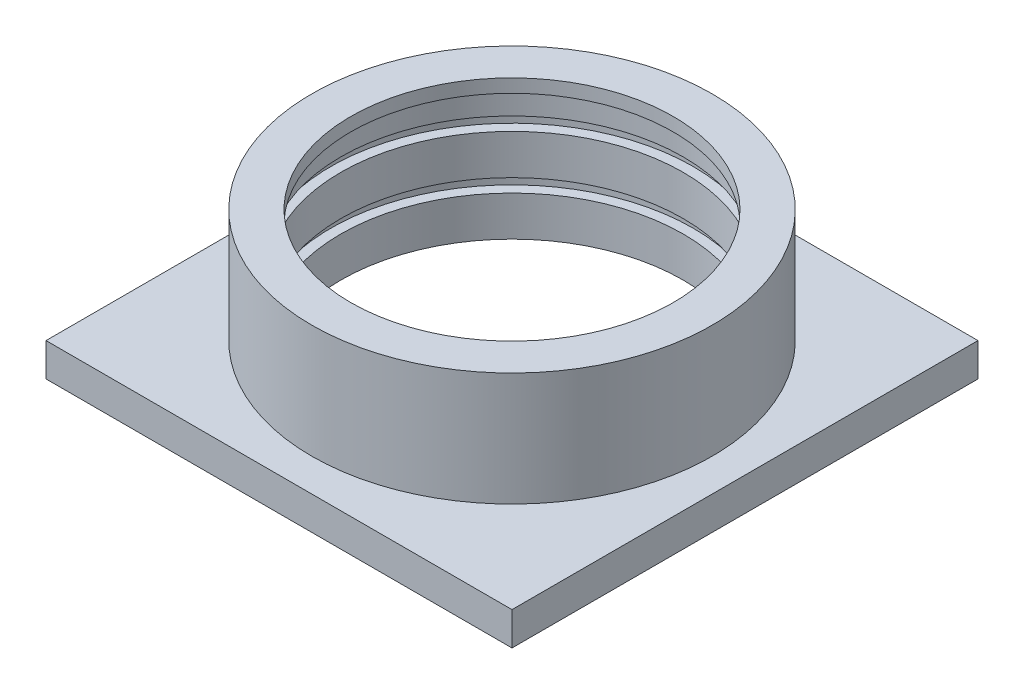
ISO-10303-21;
HEADER;
FILE_DESCRIPTION(('STEP AP214'),'2;1');
FILE_NAME('part.step','',(''),(''),'','','');
FILE_SCHEMA(('AUTOMOTIVE_DESIGN { 1 0 10303 214 1 1 1 1 }'));
ENDSEC;
DATA;
#1=APPLICATION_CONTEXT('core data for automotive mechanical design processes');
#2=APPLICATION_PROTOCOL_DEFINITION('international standard','automotive_design',2000,#1);
#3=PRODUCT_CONTEXT('',#1,'mechanical');
#4=PRODUCT('Part','Part','',(#3));
#5=PRODUCT_RELATED_PRODUCT_CATEGORY('part','',(#4));
#6=PRODUCT_DEFINITION_FORMATION('','',#4);
#7=PRODUCT_DEFINITION_CONTEXT('part definition',#1,'design');
#8=PRODUCT_DEFINITION('design','',#6,#7);
#9=PRODUCT_DEFINITION_SHAPE('','',#8);
#10=(LENGTH_UNIT() NAMED_UNIT(*) SI_UNIT(.MILLI.,.METRE.));
#11=(NAMED_UNIT(*) PLANE_ANGLE_UNIT() SI_UNIT($,.RADIAN.));
#12=(NAMED_UNIT(*) SI_UNIT($,.STERADIAN.) SOLID_ANGLE_UNIT());
#13=UNCERTAINTY_MEASURE_WITH_UNIT(LENGTH_MEASURE(1.E-05),#10,'distance_accuracy_value','');
#14=(GEOMETRIC_REPRESENTATION_CONTEXT(3) GLOBAL_UNCERTAINTY_ASSIGNED_CONTEXT((#13)) GLOBAL_UNIT_ASSIGNED_CONTEXT((#10,
#11,#12)) REPRESENTATION_CONTEXT('',''));
#15=CARTESIAN_POINT('',(0.,0.,0.));
#16=DIRECTION('',(0.,0.,1.));
#17=DIRECTION('',(1.,0.,0.));
#18=AXIS2_PLACEMENT_3D('',#15,#16,#17);
#19=CARTESIAN_POINT('',(0.,15.,0.));
#20=DIRECTION('',(0.,-1.,0.));
#21=DIRECTION('',(0.,0.,-1.));
#22=AXIS2_PLACEMENT_3D('',#19,#20,#21);
#23=CYLINDRICAL_SURFACE('',#22,25.65);
#24=CARTESIAN_POINT('',(0.,-4.98,0.));
#25=DIRECTION('',(0.,-1.,0.));
#26=DIRECTION('',(0.,0.,-1.));
#27=AXIS2_PLACEMENT_3D('',#24,#25,#26);
#28=CIRCLE('',#27,25.65);
#29=CARTESIAN_POINT('',(0.,-4.98,-25.65));
#30=VERTEX_POINT('',#29);
#31=EDGE_CURVE('E177',#30,#30,#28,.T.);
#32=ORIENTED_EDGE('',*,*,#31,.T.);
#33=EDGE_LOOP('',(#32));
#34=FACE_BOUND('',#33,.T.);
#35=CARTESIAN_POINT('',(0.,1.,0.));
#36=DIRECTION('',(0.,1.,0.));
#37=DIRECTION('',(0.,0.,1.));
#38=AXIS2_PLACEMENT_3D('',#35,#36,#37);
#39=CIRCLE('',#38,25.65);
#40=CARTESIAN_POINT('',(0.,1.,25.65));
#41=VERTEX_POINT('',#40);
#42=EDGE_CURVE('E49',#41,#41,#39,.F.);
#43=ORIENTED_EDGE('',*,*,#42,.F.);
#44=EDGE_LOOP('',(#43));
#45=FACE_BOUND('',#44,.T.);
#46=ADVANCED_FACE('F45',(#34,#45),#23,.F.);
#47=CARTESIAN_POINT('',(0.,3.,0.));
#48=DIRECTION('',(0.,1.,0.));
#49=DIRECTION('',(0.,0.,1.));
#50=AXIS2_PLACEMENT_3D('',#47,#48,#49);
#51=CIRCLE('',#50,25.65);
#52=CARTESIAN_POINT('',(0.,3.,25.65));
#53=VERTEX_POINT('',#52);
#54=EDGE_CURVE('E148',#53,#53,#51,.F.);
#55=ORIENTED_EDGE('',*,*,#54,.T.);
#56=EDGE_LOOP('',(#55));
#57=FACE_BOUND('',#56,.T.);
#58=CARTESIAN_POINT('',(0.,9.,0.));
#59=DIRECTION('',(0.,1.,0.));
#60=DIRECTION('',(0.,0.,1.));
#61=AXIS2_PLACEMENT_3D('',#58,#59,#60);
#62=CIRCLE('',#61,25.65);
#63=CARTESIAN_POINT('',(0.,9.,25.65));
#64=VERTEX_POINT('',#63);
#65=EDGE_CURVE('E143',#64,#64,#62,.F.);
#66=ORIENTED_EDGE('',*,*,#65,.F.);
#67=EDGE_LOOP('',(#66));
#68=FACE_BOUND('',#67,.T.);
#69=ADVANCED_FACE('F212',(#57,#68),#23,.F.);
#70=CARTESIAN_POINT('',(34.9,-4.98,-34.9));
#71=DIRECTION('',(1.,0.,0.));
#72=DIRECTION('',(0.,0.,-1.));
#73=AXIS2_PLACEMENT_3D('',#70,#71,#72);
#74=PLANE('',#73);
#75=DIRECTION('',(0.,0.,-1.));
#76=VECTOR('',#75,1.);
#77=CARTESIAN_POINT('',(34.9,0.,-34.9));
#78=LINE('',#77,#76);
#79=CARTESIAN_POINT('',(34.9,0.,34.9));
#80=VERTEX_POINT('',#79);
#81=CARTESIAN_POINT('',(34.9,0.,-34.9));
#82=VERTEX_POINT('',#81);
#83=EDGE_CURVE('E120',#80,#82,#78,.T.);
#84=ORIENTED_EDGE('',*,*,#83,.F.);
#85=DIRECTION('',(0.,1.,0.));
#86=VECTOR('',#85,1.);
#87=CARTESIAN_POINT('',(34.9,-4.98,34.9));
#88=LINE('',#87,#86);
#89=CARTESIAN_POINT('',(34.9,-4.98,34.9));
#90=VERTEX_POINT('',#89);
#91=EDGE_CURVE('E56',#90,#80,#88,.T.);
#92=ORIENTED_EDGE('',*,*,#91,.F.);
#93=DIRECTION('',(0.,0.,-1.));
#94=VECTOR('',#93,1.);
#95=CARTESIAN_POINT('',(34.9,-4.98,-34.9));
#96=LINE('',#95,#94);
#97=CARTESIAN_POINT('',(34.9,-4.98,-34.9));
#98=VERTEX_POINT('',#97);
#99=EDGE_CURVE('E112',#90,#98,#96,.T.);
#100=ORIENTED_EDGE('',*,*,#99,.T.);
#101=DIRECTION('',(0.,1.,0.));
#102=VECTOR('',#101,1.);
#103=CARTESIAN_POINT('',(34.9,-4.98,-34.9));
#104=LINE('',#103,#102);
#105=EDGE_CURVE('E92',#98,#82,#104,.T.);
#106=ORIENTED_EDGE('',*,*,#105,.T.);
#107=EDGE_LOOP('',(#84,#92,#100,#106));
#108=FACE_BOUND('',#107,.T.);
#109=ADVANCED_FACE('F47',(#108),#74,.T.);
#110=CARTESIAN_POINT('',(-34.9,-4.98,34.9));
#111=DIRECTION('',(0.,0.,1.));
#112=DIRECTION('',(1.,0.,0.));
#113=AXIS2_PLACEMENT_3D('',#110,#111,#112);
#114=PLANE('',#113);
#115=DIRECTION('',(1.,0.,0.));
#116=VECTOR('',#115,1.);
#117=CARTESIAN_POINT('',(-34.9,0.,34.9));
#118=LINE('',#117,#116);
#119=CARTESIAN_POINT('',(-34.9,0.,34.9));
#120=VERTEX_POINT('',#119);
#121=EDGE_CURVE('E115',#120,#80,#118,.T.);
#122=ORIENTED_EDGE('',*,*,#121,.F.);
#123=DIRECTION('',(0.,1.,0.));
#124=VECTOR('',#123,1.);
#125=CARTESIAN_POINT('',(-34.9,-4.98,34.9));
#126=LINE('',#125,#124);
#127=CARTESIAN_POINT('',(-34.9,-4.98,34.9));
#128=VERTEX_POINT('',#127);
#129=EDGE_CURVE('E81',#128,#120,#126,.T.);
#130=ORIENTED_EDGE('',*,*,#129,.F.);
#131=DIRECTION('',(1.,0.,0.));
#132=VECTOR('',#131,1.);
#133=CARTESIAN_POINT('',(-34.9,-4.98,34.9));
#134=LINE('',#133,#132);
#135=EDGE_CURVE('E107',#128,#90,#134,.T.);
#136=ORIENTED_EDGE('',*,*,#135,.T.);
#137=ORIENTED_EDGE('',*,*,#91,.T.);
#138=EDGE_LOOP('',(#122,#130,#136,#137));
#139=FACE_BOUND('',#138,.T.);
#140=ADVANCED_FACE('F204',(#139),#114,.T.);
#141=CARTESIAN_POINT('',(-34.9,-4.98,-34.9));
#142=DIRECTION('',(-1.,0.,0.));
#143=DIRECTION('',(0.,0.,1.));
#144=AXIS2_PLACEMENT_3D('',#141,#142,#143);
#145=PLANE('',#144);
#146=DIRECTION('',(0.,0.,1.));
#147=VECTOR('',#146,1.);
#148=CARTESIAN_POINT('',(-34.9,0.,-34.9));
#149=LINE('',#148,#147);
#150=CARTESIAN_POINT('',(-34.9,0.,-34.9));
#151=VERTEX_POINT('',#150);
#152=EDGE_CURVE('E100',#151,#120,#149,.T.);
#153=ORIENTED_EDGE('',*,*,#152,.F.);
#154=DIRECTION('',(0.,1.,0.));
#155=VECTOR('',#154,1.);
#156=CARTESIAN_POINT('',(-34.9,-4.98,-34.9));
#157=LINE('',#156,#155);
#158=CARTESIAN_POINT('',(-34.9,-4.98,-34.9));
#159=VERTEX_POINT('',#158);
#160=EDGE_CURVE('E95',#159,#151,#157,.T.);
#161=ORIENTED_EDGE('',*,*,#160,.F.);
#162=DIRECTION('',(0.,0.,1.));
#163=VECTOR('',#162,1.);
#164=CARTESIAN_POINT('',(-34.9,-4.98,-34.9));
#165=LINE('',#164,#163);
#166=EDGE_CURVE('E98',#159,#128,#165,.T.);
#167=ORIENTED_EDGE('',*,*,#166,.T.);
#168=ORIENTED_EDGE('',*,*,#129,.T.);
#169=EDGE_LOOP('',(#153,#161,#167,#168));
#170=FACE_BOUND('',#169,.T.);
#171=ADVANCED_FACE('F97',(#170),#145,.T.);
#172=CARTESIAN_POINT('',(-34.9,-4.98,-34.9));
#173=DIRECTION('',(0.,0.,-1.));
#174=DIRECTION('',(-1.,0.,0.));
#175=AXIS2_PLACEMENT_3D('',#172,#173,#174);
#176=PLANE('',#175);
#177=DIRECTION('',(-1.,0.,0.));
#178=VECTOR('',#177,1.);
#179=CARTESIAN_POINT('',(-34.9,0.,-34.9));
#180=LINE('',#179,#178);
#181=EDGE_CURVE('E124',#82,#151,#180,.T.);
#182=ORIENTED_EDGE('',*,*,#181,.F.);
#183=ORIENTED_EDGE('',*,*,#105,.F.);
#184=DIRECTION('',(-1.,0.,0.));
#185=VECTOR('',#184,1.);
#186=CARTESIAN_POINT('',(-34.9,-4.98,-34.9));
#187=LINE('',#186,#185);
#188=EDGE_CURVE('E106',#98,#159,#187,.T.);
#189=ORIENTED_EDGE('',*,*,#188,.T.);
#190=ORIENTED_EDGE('',*,*,#160,.T.);
#191=EDGE_LOOP('',(#182,#183,#189,#190));
#192=FACE_BOUND('',#191,.T.);
#193=ADVANCED_FACE('F110',(#192),#176,.T.);
#194=CARTESIAN_POINT('',(0.,-4.98,0.));
#195=DIRECTION('',(0.,1.,0.));
#196=DIRECTION('',(0.,0.,1.));
#197=AXIS2_PLACEMENT_3D('',#194,#195,#196);
#198=PLANE('',#197);
#199=ORIENTED_EDGE('',*,*,#31,.F.);
#200=EDGE_LOOP('',(#199));
#201=FACE_BOUND('',#200,.T.);
#202=ORIENTED_EDGE('',*,*,#99,.F.);
#203=ORIENTED_EDGE('',*,*,#135,.F.);
#204=ORIENTED_EDGE('',*,*,#166,.F.);
#205=ORIENTED_EDGE('',*,*,#188,.F.);
#206=EDGE_LOOP('',(#202,#203,#204,#205));
#207=FACE_BOUND('',#206,.T.);
#208=ADVANCED_FACE('F105',(#201,#207),#198,.F.);
#209=CARTESIAN_POINT('',(0.,0.,0.));
#210=DIRECTION('',(0.,1.,0.));
#211=DIRECTION('',(0.,0.,1.));
#212=AXIS2_PLACEMENT_3D('',#209,#210,#211);
#213=PLANE('',#212);
#214=CARTESIAN_POINT('',(0.,0.,0.));
#215=DIRECTION('',(0.,1.,0.));
#216=DIRECTION('',(0.,0.,1.));
#217=AXIS2_PLACEMENT_3D('',#214,#215,#216);
#218=CIRCLE('',#217,30.);
#219=CARTESIAN_POINT('',(0.,0.,30.));
#220=VERTEX_POINT('',#219);
#221=EDGE_CURVE('E11',#220,#220,#218,.T.);
#222=ORIENTED_EDGE('',*,*,#221,.F.);
#223=EDGE_LOOP('',(#222));
#224=FACE_BOUND('',#223,.T.);
#225=ORIENTED_EDGE('',*,*,#83,.T.);
#226=ORIENTED_EDGE('',*,*,#181,.T.);
#227=ORIENTED_EDGE('',*,*,#152,.T.);
#228=ORIENTED_EDGE('',*,*,#121,.T.);
#229=EDGE_LOOP('',(#225,#226,#227,#228));
#230=FACE_BOUND('',#229,.T.);
#231=ADVANCED_FACE('F197',(#224,#230),#213,.T.);
#232=CARTESIAN_POINT('',(0.,17.,0.));
#233=DIRECTION('',(0.,-1.,0.));
#234=DIRECTION('',(0.,0.,-1.));
#235=AXIS2_PLACEMENT_3D('',#232,#233,#234);
#236=CYLINDRICAL_SURFACE('',#235,30.);
#237=CARTESIAN_POINT('',(0.,17.,0.));
#238=DIRECTION('',(0.,1.,0.));
#239=DIRECTION('',(0.,0.,1.));
#240=AXIS2_PLACEMENT_3D('',#237,#238,#239);
#241=CIRCLE('',#240,30.);
#242=CARTESIAN_POINT('',(0.,17.,30.));
#243=VERTEX_POINT('',#242);
#244=EDGE_CURVE('E125',#243,#243,#241,.T.);
#245=ORIENTED_EDGE('',*,*,#244,.F.);
#246=EDGE_LOOP('',(#245));
#247=FACE_BOUND('',#246,.T.);
#248=ORIENTED_EDGE('',*,*,#221,.T.);
#249=EDGE_LOOP('',(#248));
#250=FACE_BOUND('',#249,.T.);
#251=ADVANCED_FACE('F194',(#247,#250),#236,.T.);
#252=CARTESIAN_POINT('',(0.,17.,0.));
#253=DIRECTION('',(0.,1.,0.));
#254=DIRECTION('',(0.,0.,1.));
#255=AXIS2_PLACEMENT_3D('',#252,#253,#254);
#256=PLANE('',#255);
#257=CARTESIAN_POINT('',(0.,17.,0.));
#258=DIRECTION('',(0.,1.,0.));
#259=DIRECTION('',(0.,0.,1.));
#260=AXIS2_PLACEMENT_3D('',#257,#258,#259);
#261=CIRCLE('',#260,24.15);
#262=CARTESIAN_POINT('',(0.,17.,24.15));
#263=VERTEX_POINT('',#262);
#264=EDGE_CURVE('E147',#263,#263,#261,.T.);
#265=ORIENTED_EDGE('',*,*,#264,.F.);
#266=EDGE_LOOP('',(#265));
#267=FACE_BOUND('',#266,.T.);
#268=ORIENTED_EDGE('',*,*,#244,.T.);
#269=EDGE_LOOP('',(#268));
#270=FACE_BOUND('',#269,.T.);
#271=ADVANCED_FACE('F192',(#267,#270),#256,.T.);
#272=CARTESIAN_POINT('',(0.,11.,0.));
#273=DIRECTION('',(0.,1.,0.));
#274=DIRECTION('',(0.,0.,1.));
#275=AXIS2_PLACEMENT_3D('',#272,#273,#274);
#276=CIRCLE('',#275,25.65);
#277=CARTESIAN_POINT('',(0.,11.,25.65));
#278=VERTEX_POINT('',#277);
#279=EDGE_CURVE('E139',#278,#278,#276,.F.);
#280=ORIENTED_EDGE('',*,*,#279,.T.);
#281=EDGE_LOOP('',(#280));
#282=FACE_BOUND('',#281,.T.);
#283=CARTESIAN_POINT('',(0.,15.,0.));
#284=DIRECTION('',(0.,-1.,0.));
#285=DIRECTION('',(0.,0.,-1.));
#286=AXIS2_PLACEMENT_3D('',#283,#284,#285);
#287=CIRCLE('',#286,25.65);
#288=CARTESIAN_POINT('',(0.,15.,-25.65));
#289=VERTEX_POINT('',#288);
#290=EDGE_CURVE('E181',#289,#289,#287,.T.);
#291=ORIENTED_EDGE('',*,*,#290,.F.);
#292=EDGE_LOOP('',(#291));
#293=FACE_BOUND('',#292,.T.);
#294=ADVANCED_FACE('F216',(#282,#293),#23,.F.);
#295=CARTESIAN_POINT('',(0.,15.,0.));
#296=DIRECTION('',(0.,-1.,0.));
#297=DIRECTION('',(0.,0.,-1.));
#298=AXIS2_PLACEMENT_3D('',#295,#296,#297);
#299=PLANE('',#298);
#300=CARTESIAN_POINT('',(0.,15.,0.));
#301=DIRECTION('',(0.,1.,0.));
#302=DIRECTION('',(0.,0.,1.));
#303=AXIS2_PLACEMENT_3D('',#300,#301,#302);
#304=CIRCLE('',#303,24.15);
#305=CARTESIAN_POINT('',(0.,15.,24.15));
#306=VERTEX_POINT('',#305);
#307=EDGE_CURVE('E173',#306,#306,#304,.T.);
#308=ORIENTED_EDGE('',*,*,#307,.T.);
#309=EDGE_LOOP('',(#308));
#310=FACE_BOUND('',#309,.T.);
#311=ORIENTED_EDGE('',*,*,#290,.T.);
#312=EDGE_LOOP('',(#311));
#313=FACE_BOUND('',#312,.T.);
#314=ADVANCED_FACE('F225',(#310,#313),#299,.T.);
#315=CARTESIAN_POINT('',(0.,15.,0.));
#316=DIRECTION('',(0.,1.,0.));
#317=DIRECTION('',(0.,0.,1.));
#318=AXIS2_PLACEMENT_3D('',#315,#316,#317);
#319=CYLINDRICAL_SURFACE('',#318,24.15);
#320=ORIENTED_EDGE('',*,*,#307,.F.);
#321=EDGE_LOOP('',(#320));
#322=FACE_BOUND('',#321,.T.);
#323=ORIENTED_EDGE('',*,*,#264,.T.);
#324=EDGE_LOOP('',(#323));
#325=FACE_BOUND('',#324,.T.);
#326=ADVANCED_FACE('F232',(#322,#325),#319,.F.);
#327=CARTESIAN_POINT('',(0.,9.,0.));
#328=DIRECTION('',(0.,1.,0.));
#329=DIRECTION('',(0.,0.,1.));
#330=AXIS2_PLACEMENT_3D('',#327,#328,#329);
#331=PLANE('',#330);
#332=CARTESIAN_POINT('',(0.,9.,0.));
#333=DIRECTION('',(0.,1.,0.));
#334=DIRECTION('',(0.,0.,1.));
#335=AXIS2_PLACEMENT_3D('',#332,#333,#334);
#336=CIRCLE('',#335,27.15);
#337=CARTESIAN_POINT('',(0.,9.,27.15));
#338=VERTEX_POINT('',#337);
#339=EDGE_CURVE('E144',#338,#338,#336,.T.);
#340=ORIENTED_EDGE('',*,*,#339,.T.);
#341=EDGE_LOOP('',(#340));
#342=FACE_BOUND('',#341,.T.);
#343=ORIENTED_EDGE('',*,*,#65,.T.);
#344=EDGE_LOOP('',(#343));
#345=FACE_BOUND('',#344,.T.);
#346=ADVANCED_FACE('F244',(#342,#345),#331,.T.);
#347=CARTESIAN_POINT('',(0.,11.,0.));
#348=DIRECTION('',(0.,1.,0.));
#349=DIRECTION('',(0.,0.,1.));
#350=AXIS2_PLACEMENT_3D('',#347,#348,#349);
#351=PLANE('',#350);
#352=CARTESIAN_POINT('',(0.,11.,0.));
#353=DIRECTION('',(0.,1.,0.));
#354=DIRECTION('',(0.,0.,1.));
#355=AXIS2_PLACEMENT_3D('',#352,#353,#354);
#356=CIRCLE('',#355,27.15);
#357=CARTESIAN_POINT('',(0.,11.,27.15));
#358=VERTEX_POINT('',#357);
#359=EDGE_CURVE('E157',#358,#358,#356,.T.);
#360=ORIENTED_EDGE('',*,*,#359,.F.);
#361=EDGE_LOOP('',(#360));
#362=FACE_BOUND('',#361,.T.);
#363=ORIENTED_EDGE('',*,*,#279,.F.);
#364=EDGE_LOOP('',(#363));
#365=FACE_BOUND('',#364,.T.);
#366=ADVANCED_FACE('F241',(#362,#365),#351,.F.);
#367=CARTESIAN_POINT('',(0.,9.,0.));
#368=DIRECTION('',(0.,1.,0.));
#369=DIRECTION('',(0.,0.,1.));
#370=AXIS2_PLACEMENT_3D('',#367,#368,#369);
#371=CYLINDRICAL_SURFACE('',#370,27.15);
#372=ORIENTED_EDGE('',*,*,#339,.F.);
#373=EDGE_LOOP('',(#372));
#374=FACE_BOUND('',#373,.T.);
#375=ORIENTED_EDGE('',*,*,#359,.T.);
#376=EDGE_LOOP('',(#375));
#377=FACE_BOUND('',#376,.T.);
#378=ADVANCED_FACE('F243',(#374,#377),#371,.F.);
#379=CARTESIAN_POINT('',(0.,1.,0.));
#380=DIRECTION('',(0.,1.,0.));
#381=DIRECTION('',(0.,0.,1.));
#382=AXIS2_PLACEMENT_3D('',#379,#380,#381);
#383=PLANE('',#382);
#384=CARTESIAN_POINT('',(0.,1.,0.));
#385=DIRECTION('',(0.,1.,0.));
#386=DIRECTION('',(0.,0.,1.));
#387=AXIS2_PLACEMENT_3D('',#384,#385,#386);
#388=CIRCLE('',#387,27.15);
#389=CARTESIAN_POINT('',(0.,1.,27.15));
#390=VERTEX_POINT('',#389);
#391=EDGE_CURVE('E151',#390,#390,#388,.T.);
#392=ORIENTED_EDGE('',*,*,#391,.T.);
#393=EDGE_LOOP('',(#392));
#394=FACE_BOUND('',#393,.T.);
#395=ORIENTED_EDGE('',*,*,#42,.T.);
#396=EDGE_LOOP('',(#395));
#397=FACE_BOUND('',#396,.T.);
#398=ADVANCED_FACE('F249',(#394,#397),#383,.T.);
#399=CARTESIAN_POINT('',(0.,3.,0.));
#400=DIRECTION('',(0.,1.,0.));
#401=DIRECTION('',(0.,0.,1.));
#402=AXIS2_PLACEMENT_3D('',#399,#400,#401);
#403=PLANE('',#402);
#404=CARTESIAN_POINT('',(0.,3.,0.));
#405=DIRECTION('',(0.,1.,0.));
#406=DIRECTION('',(0.,0.,1.));
#407=AXIS2_PLACEMENT_3D('',#404,#405,#406);
#408=CIRCLE('',#407,27.15);
#409=CARTESIAN_POINT('',(0.,3.,27.15));
#410=VERTEX_POINT('',#409);
#411=EDGE_CURVE('E159',#410,#410,#408,.T.);
#412=ORIENTED_EDGE('',*,*,#411,.F.);
#413=EDGE_LOOP('',(#412));
#414=FACE_BOUND('',#413,.T.);
#415=ORIENTED_EDGE('',*,*,#54,.F.);
#416=EDGE_LOOP('',(#415));
#417=FACE_BOUND('',#416,.T.);
#418=ADVANCED_FACE('F355',(#414,#417),#403,.F.);
#419=CARTESIAN_POINT('',(0.,1.,0.));
#420=DIRECTION('',(0.,1.,0.));
#421=DIRECTION('',(0.,0.,1.));
#422=AXIS2_PLACEMENT_3D('',#419,#420,#421);
#423=CYLINDRICAL_SURFACE('',#422,27.15);
#424=ORIENTED_EDGE('',*,*,#391,.F.);
#425=EDGE_LOOP('',(#424));
#426=FACE_BOUND('',#425,.T.);
#427=ORIENTED_EDGE('',*,*,#411,.T.);
#428=EDGE_LOOP('',(#427));
#429=FACE_BOUND('',#428,.T.);
#430=ADVANCED_FACE('F363',(#426,#429),#423,.F.);
#431=CLOSED_SHELL('',(#46,#69,#109,#140,#171,#193,#208,#231,#251,#271,#294,#314,#326,#346,#366,
#378,#398,#418,#430));
#432=MANIFOLD_SOLID_BREP('B2',#431);
#433=ADVANCED_BREP_SHAPE_REPRESENTATION('',(#18,#432),#14);
#434=SHAPE_DEFINITION_REPRESENTATION(#9,#433);
ENDSEC;
END-ISO-10303-21;
